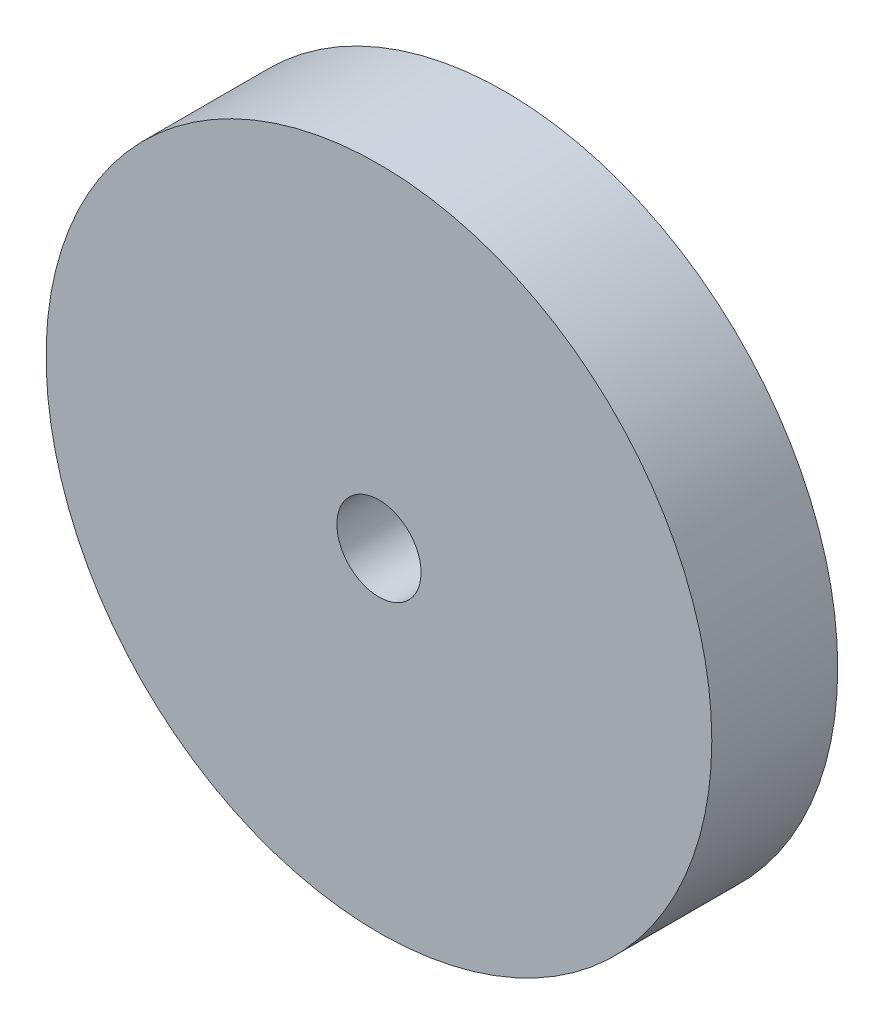
ISO-10303-21;
HEADER;
FILE_DESCRIPTION(('STEP AP214'),'2;1');
FILE_NAME('part.step','',(''),(''),'','','');
FILE_SCHEMA(('AUTOMOTIVE_DESIGN { 1 0 10303 214 1 1 1 1 }'));
ENDSEC;
DATA;
#1=APPLICATION_CONTEXT('core data for automotive mechanical design processes');
#2=APPLICATION_PROTOCOL_DEFINITION('international standard','automotive_design',2000,#1);
#3=PRODUCT_CONTEXT('',#1,'mechanical');
#4=PRODUCT('Part','Part','',(#3));
#5=PRODUCT_RELATED_PRODUCT_CATEGORY('part','',(#4));
#6=PRODUCT_DEFINITION_FORMATION('','',#4);
#7=PRODUCT_DEFINITION_CONTEXT('part definition',#1,'design');
#8=PRODUCT_DEFINITION('design','',#6,#7);
#9=PRODUCT_DEFINITION_SHAPE('','',#8);
#10=(LENGTH_UNIT() NAMED_UNIT(*) SI_UNIT(.MILLI.,.METRE.));
#11=(NAMED_UNIT(*) PLANE_ANGLE_UNIT() SI_UNIT($,.RADIAN.));
#12=(NAMED_UNIT(*) SI_UNIT($,.STERADIAN.) SOLID_ANGLE_UNIT());
#13=UNCERTAINTY_MEASURE_WITH_UNIT(LENGTH_MEASURE(1.E-05),#10,'distance_accuracy_value','');
#14=(GEOMETRIC_REPRESENTATION_CONTEXT(3) GLOBAL_UNCERTAINTY_ASSIGNED_CONTEXT((#13)) GLOBAL_UNIT_ASSIGNED_CONTEXT((#10,
#11,#12)) REPRESENTATION_CONTEXT('',''));
#15=CARTESIAN_POINT('',(0.,0.,0.));
#16=DIRECTION('',(0.,0.,1.));
#17=DIRECTION('',(1.,0.,0.));
#18=AXIS2_PLACEMENT_3D('',#15,#16,#17);
#19=CARTESIAN_POINT('',(0.,0.,5.588));
#20=DIRECTION('',(0.,0.,1.));
#21=DIRECTION('',(1.,0.,0.));
#22=AXIS2_PLACEMENT_3D('',#19,#20,#21);
#23=PLANE('',#22);
#24=CARTESIAN_POINT('',(0.,0.,5.588));
#25=DIRECTION('',(0.,0.,1.));
#26=DIRECTION('',(1.,0.,0.));
#27=AXIS2_PLACEMENT_3D('',#24,#25,#26);
#28=CIRCLE('',#27,14.7703125);
#29=CARTESIAN_POINT('',(14.7703125,0.,5.588));
#30=VERTEX_POINT('',#29);
#31=EDGE_CURVE('E10',#30,#30,#28,.T.);
#32=ORIENTED_EDGE('',*,*,#31,.T.);
#33=EDGE_LOOP('',(#32));
#34=FACE_BOUND('',#33,.T.);
#35=CARTESIAN_POINT('',(0.,0.,5.588));
#36=DIRECTION('',(0.,0.,1.));
#37=DIRECTION('',(1.,0.,0.));
#38=AXIS2_PLACEMENT_3D('',#35,#36,#37);
#39=CIRCLE('',#38,1.8669);
#40=CARTESIAN_POINT('',(1.8669,0.,5.588));
#41=VERTEX_POINT('',#40);
#42=EDGE_CURVE('E46',#41,#41,#39,.T.);
#43=ORIENTED_EDGE('',*,*,#42,.F.);
#44=EDGE_LOOP('',(#43));
#45=FACE_BOUND('',#44,.T.);
#46=ADVANCED_FACE('F35',(#34,#45),#23,.T.);
#47=CARTESIAN_POINT('',(0.,0.,0.));
#48=DIRECTION('',(0.,0.,1.));
#49=DIRECTION('',(1.,0.,0.));
#50=AXIS2_PLACEMENT_3D('',#47,#48,#49);
#51=PLANE('',#50);
#52=CARTESIAN_POINT('',(0.,0.,0.));
#53=DIRECTION('',(0.,0.,1.));
#54=DIRECTION('',(1.,0.,0.));
#55=AXIS2_PLACEMENT_3D('',#52,#53,#54);
#56=CIRCLE('',#55,14.7703125);
#57=CARTESIAN_POINT('',(14.7703125,0.,0.));
#58=VERTEX_POINT('',#57);
#59=EDGE_CURVE('E39',#58,#58,#56,.T.);
#60=ORIENTED_EDGE('',*,*,#59,.F.);
#61=EDGE_LOOP('',(#60));
#62=FACE_BOUND('',#61,.T.);
#63=CARTESIAN_POINT('',(0.,0.,0.));
#64=DIRECTION('',(0.,0.,1.));
#65=DIRECTION('',(1.,0.,0.));
#66=AXIS2_PLACEMENT_3D('',#63,#64,#65);
#67=CIRCLE('',#66,1.8669);
#68=CARTESIAN_POINT('',(1.8669,0.,0.));
#69=VERTEX_POINT('',#68);
#70=EDGE_CURVE('E48',#69,#69,#67,.T.);
#71=ORIENTED_EDGE('',*,*,#70,.T.);
#72=EDGE_LOOP('',(#71));
#73=FACE_BOUND('',#72,.T.);
#74=ADVANCED_FACE('F58',(#62,#73),#51,.F.);
#75=CARTESIAN_POINT('',(0.,0.,5.588));
#76=DIRECTION('',(0.,0.,-1.));
#77=DIRECTION('',(-1.,0.,0.));
#78=AXIS2_PLACEMENT_3D('',#75,#76,#77);
#79=CYLINDRICAL_SURFACE('',#78,14.7703125);
#80=ORIENTED_EDGE('',*,*,#31,.F.);
#81=EDGE_LOOP('',(#80));
#82=FACE_BOUND('',#81,.T.);
#83=ORIENTED_EDGE('',*,*,#59,.T.);
#84=EDGE_LOOP('',(#83));
#85=FACE_BOUND('',#84,.T.);
#86=ADVANCED_FACE('F37',(#82,#85),#79,.T.);
#87=CARTESIAN_POINT('',(0.,0.,5.588));
#88=DIRECTION('',(0.,0.,-1.));
#89=DIRECTION('',(-1.,0.,0.));
#90=AXIS2_PLACEMENT_3D('',#87,#88,#89);
#91=CYLINDRICAL_SURFACE('',#90,1.8669);
#92=ORIENTED_EDGE('',*,*,#42,.T.);
#93=EDGE_LOOP('',(#92));
#94=FACE_BOUND('',#93,.T.);
#95=ORIENTED_EDGE('',*,*,#70,.F.);
#96=EDGE_LOOP('',(#95));
#97=FACE_BOUND('',#96,.T.);
#98=ADVANCED_FACE('F54',(#94,#97),#91,.F.);
#99=CLOSED_SHELL('',(#46,#74,#86,#98));
#100=MANIFOLD_SOLID_BREP('B2',#99);
#101=ADVANCED_BREP_SHAPE_REPRESENTATION('',(#18,#100),#14);
#102=SHAPE_DEFINITION_REPRESENTATION(#9,#101);
ENDSEC;
END-ISO-10303-21;
